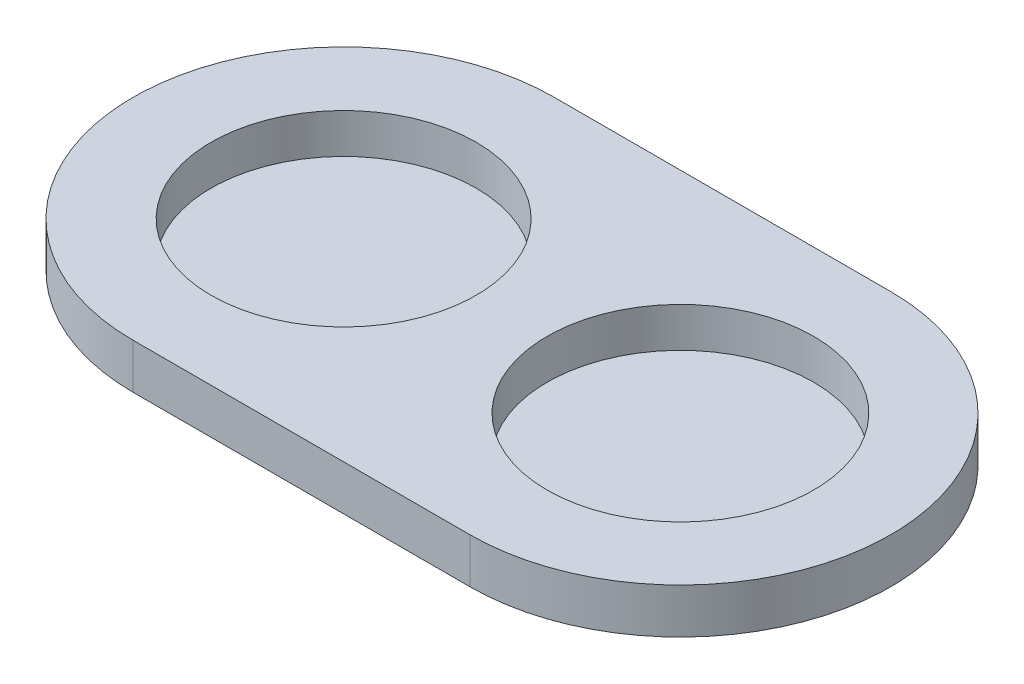
ISO-10303-21;
HEADER;
FILE_DESCRIPTION(('STEP AP214'),'2;1');
FILE_NAME('part.step','',(''),(''),'','','');
FILE_SCHEMA(('AUTOMOTIVE_DESIGN { 1 0 10303 214 1 1 1 1 }'));
ENDSEC;
DATA;
#1=APPLICATION_CONTEXT('core data for automotive mechanical design processes');
#2=APPLICATION_PROTOCOL_DEFINITION('international standard','automotive_design',2000,#1);
#3=PRODUCT_CONTEXT('',#1,'mechanical');
#4=PRODUCT('Part','Part','',(#3));
#5=PRODUCT_RELATED_PRODUCT_CATEGORY('part','',(#4));
#6=PRODUCT_DEFINITION_FORMATION('','',#4);
#7=PRODUCT_DEFINITION_CONTEXT('part definition',#1,'design');
#8=PRODUCT_DEFINITION('design','',#6,#7);
#9=PRODUCT_DEFINITION_SHAPE('','',#8);
#10=(LENGTH_UNIT() NAMED_UNIT(*) SI_UNIT(.MILLI.,.METRE.));
#11=(NAMED_UNIT(*) PLANE_ANGLE_UNIT() SI_UNIT($,.RADIAN.));
#12=(NAMED_UNIT(*) SI_UNIT($,.STERADIAN.) SOLID_ANGLE_UNIT());
#13=UNCERTAINTY_MEASURE_WITH_UNIT(LENGTH_MEASURE(1.E-05),#10,'distance_accuracy_value','');
#14=(GEOMETRIC_REPRESENTATION_CONTEXT(3) GLOBAL_UNCERTAINTY_ASSIGNED_CONTEXT((#13)) GLOBAL_UNIT_ASSIGNED_CONTEXT((#10,
#11,#12)) REPRESENTATION_CONTEXT('',''));
#15=CARTESIAN_POINT('',(0.,0.,0.));
#16=DIRECTION('',(0.,0.,1.));
#17=DIRECTION('',(1.,0.,0.));
#18=AXIS2_PLACEMENT_3D('',#15,#16,#17);
#19=CARTESIAN_POINT('',(0.,3.4,0.));
#20=DIRECTION('',(0.,1.,0.));
#21=DIRECTION('',(0.,0.,1.));
#22=AXIS2_PLACEMENT_3D('',#19,#20,#21);
#23=PLANE('',#22);
#24=CARTESIAN_POINT('',(0.,3.4,0.));
#25=DIRECTION('',(0.,1.,0.));
#26=DIRECTION('',(0.,0.,1.));
#27=AXIS2_PLACEMENT_3D('',#24,#25,#26);
#28=CIRCLE('',#27,10.);
#29=CARTESIAN_POINT('',(0.,3.4,10.));
#30=VERTEX_POINT('',#29);
#31=EDGE_CURVE('E108',#30,#30,#28,.T.);
#32=ORIENTED_EDGE('',*,*,#31,.F.);
#33=EDGE_LOOP('',(#32));
#34=FACE_BOUND('',#33,.T.);
#35=CARTESIAN_POINT('',(0.,3.4,0.));
#36=DIRECTION('',(0.,1.,0.));
#37=DIRECTION('',(0.,0.,1.));
#38=AXIS2_PLACEMENT_3D('',#35,#36,#37);
#39=CIRCLE('',#38,15.875);
#40=CARTESIAN_POINT('',(0.,3.4,-15.875));
#41=VERTEX_POINT('',#40);
#42=CARTESIAN_POINT('',(0.,3.4,15.875));
#43=VERTEX_POINT('',#42);
#44=EDGE_CURVE('E90',#41,#43,#39,.T.);
#45=ORIENTED_EDGE('',*,*,#44,.T.);
#46=DIRECTION('',(1.,0.,0.));
#47=VECTOR('',#46,1.);
#48=CARTESIAN_POINT('',(0.,3.4,15.875));
#49=LINE('',#48,#47);
#50=CARTESIAN_POINT('',(25.4,3.4,15.875));
#51=VERTEX_POINT('',#50);
#52=EDGE_CURVE('E85',#43,#51,#49,.T.);
#53=ORIENTED_EDGE('',*,*,#52,.T.);
#54=CARTESIAN_POINT('',(25.4,3.4,0.));
#55=DIRECTION('',(0.,1.,0.));
#56=DIRECTION('',(0.,0.,1.));
#57=AXIS2_PLACEMENT_3D('',#54,#55,#56);
#58=CIRCLE('',#57,15.875);
#59=CARTESIAN_POINT('',(25.4,3.4,-15.875));
#60=VERTEX_POINT('',#59);
#61=EDGE_CURVE('E88',#51,#60,#58,.T.);
#62=ORIENTED_EDGE('',*,*,#61,.T.);
#63=DIRECTION('',(-1.,0.,0.));
#64=VECTOR('',#63,1.);
#65=CARTESIAN_POINT('',(0.,3.4,-15.875));
#66=LINE('',#65,#64);
#67=EDGE_CURVE('E54',#60,#41,#66,.T.);
#68=ORIENTED_EDGE('',*,*,#67,.T.);
#69=EDGE_LOOP('',(#45,#53,#62,#68));
#70=FACE_BOUND('',#69,.T.);
#71=CARTESIAN_POINT('',(25.4,3.4,0.));
#72=DIRECTION('',(0.,1.,0.));
#73=DIRECTION('',(0.,0.,1.));
#74=AXIS2_PLACEMENT_3D('',#71,#72,#73);
#75=CIRCLE('',#74,10.05);
#76=CARTESIAN_POINT('',(25.4,3.4,10.05));
#77=VERTEX_POINT('',#76);
#78=EDGE_CURVE('E128',#77,#77,#75,.T.);
#79=ORIENTED_EDGE('',*,*,#78,.F.);
#80=EDGE_LOOP('',(#79));
#81=FACE_BOUND('',#80,.T.);
#82=ADVANCED_FACE('F37',(#34,#70,#81),#23,.T.);
#83=CARTESIAN_POINT('',(0.,0.,0.));
#84=DIRECTION('',(0.,1.,0.));
#85=DIRECTION('',(0.,0.,1.));
#86=AXIS2_PLACEMENT_3D('',#83,#84,#85);
#87=PLANE('',#86);
#88=CARTESIAN_POINT('',(0.,0.,0.));
#89=DIRECTION('',(0.,1.,0.));
#90=DIRECTION('',(0.,0.,1.));
#91=AXIS2_PLACEMENT_3D('',#88,#89,#90);
#92=CIRCLE('',#91,15.875);
#93=CARTESIAN_POINT('',(0.,0.,-15.875));
#94=VERTEX_POINT('',#93);
#95=CARTESIAN_POINT('',(0.,0.,15.875));
#96=VERTEX_POINT('',#95);
#97=EDGE_CURVE('E105',#94,#96,#92,.T.);
#98=ORIENTED_EDGE('',*,*,#97,.F.);
#99=DIRECTION('',(-1.,0.,0.));
#100=VECTOR('',#99,1.);
#101=CARTESIAN_POINT('',(0.,0.,-15.875));
#102=LINE('',#101,#100);
#103=CARTESIAN_POINT('',(25.4,0.,-15.875));
#104=VERTEX_POINT('',#103);
#105=EDGE_CURVE('E77',#104,#94,#102,.T.);
#106=ORIENTED_EDGE('',*,*,#105,.F.);
#107=CARTESIAN_POINT('',(25.4,0.,0.));
#108=DIRECTION('',(0.,1.,0.));
#109=DIRECTION('',(0.,0.,1.));
#110=AXIS2_PLACEMENT_3D('',#107,#108,#109);
#111=CIRCLE('',#110,15.875);
#112=CARTESIAN_POINT('',(25.4,0.,15.875));
#113=VERTEX_POINT('',#112);
#114=EDGE_CURVE('E71',#113,#104,#111,.T.);
#115=ORIENTED_EDGE('',*,*,#114,.F.);
#116=DIRECTION('',(1.,0.,0.));
#117=VECTOR('',#116,1.);
#118=CARTESIAN_POINT('',(0.,0.,15.875));
#119=LINE('',#118,#117);
#120=EDGE_CURVE('E95',#96,#113,#119,.T.);
#121=ORIENTED_EDGE('',*,*,#120,.F.);
#122=EDGE_LOOP('',(#98,#106,#115,#121));
#123=FACE_BOUND('',#122,.T.);
#124=ADVANCED_FACE('F135',(#123),#87,.F.);
#125=CARTESIAN_POINT('',(0.,3.4,0.));
#126=DIRECTION('',(0.,-1.,0.));
#127=DIRECTION('',(0.,0.,-1.));
#128=AXIS2_PLACEMENT_3D('',#125,#126,#127);
#129=CYLINDRICAL_SURFACE('',#128,15.875);
#130=ORIENTED_EDGE('',*,*,#97,.T.);
#131=DIRECTION('',(0.,-1.,0.));
#132=VECTOR('',#131,1.);
#133=CARTESIAN_POINT('',(0.,3.4,15.875));
#134=LINE('',#133,#132);
#135=EDGE_CURVE('E96',#43,#96,#134,.T.);
#136=ORIENTED_EDGE('',*,*,#135,.F.);
#137=ORIENTED_EDGE('',*,*,#44,.F.);
#138=DIRECTION('',(0.,-1.,0.));
#139=VECTOR('',#138,1.);
#140=CARTESIAN_POINT('',(0.,3.4,-15.875));
#141=LINE('',#140,#139);
#142=EDGE_CURVE('E101',#41,#94,#141,.T.);
#143=ORIENTED_EDGE('',*,*,#142,.T.);
#144=EDGE_LOOP('',(#130,#136,#137,#143));
#145=FACE_BOUND('',#144,.T.);
#146=ADVANCED_FACE('F39',(#145),#129,.T.);
#147=CARTESIAN_POINT('',(0.,3.4,15.875));
#148=DIRECTION('',(0.,0.,-1.));
#149=DIRECTION('',(-1.,0.,0.));
#150=AXIS2_PLACEMENT_3D('',#147,#148,#149);
#151=PLANE('',#150);
#152=ORIENTED_EDGE('',*,*,#120,.T.);
#153=DIRECTION('',(0.,-1.,0.));
#154=VECTOR('',#153,1.);
#155=CARTESIAN_POINT('',(25.4,3.4,15.875));
#156=LINE('',#155,#154);
#157=EDGE_CURVE('E93',#51,#113,#156,.T.);
#158=ORIENTED_EDGE('',*,*,#157,.F.);
#159=ORIENTED_EDGE('',*,*,#52,.F.);
#160=ORIENTED_EDGE('',*,*,#135,.T.);
#161=EDGE_LOOP('',(#152,#158,#159,#160));
#162=FACE_BOUND('',#161,.T.);
#163=ADVANCED_FACE('F94',(#162),#151,.F.);
#164=CARTESIAN_POINT('',(25.4,3.4,0.));
#165=DIRECTION('',(0.,-1.,0.));
#166=DIRECTION('',(0.,0.,-1.));
#167=AXIS2_PLACEMENT_3D('',#164,#165,#166);
#168=CYLINDRICAL_SURFACE('',#167,15.875);
#169=ORIENTED_EDGE('',*,*,#114,.T.);
#170=DIRECTION('',(0.,-1.,0.));
#171=VECTOR('',#170,1.);
#172=CARTESIAN_POINT('',(25.4,3.4,-15.875));
#173=LINE('',#172,#171);
#174=EDGE_CURVE('E97',#60,#104,#173,.T.);
#175=ORIENTED_EDGE('',*,*,#174,.F.);
#176=ORIENTED_EDGE('',*,*,#61,.F.);
#177=ORIENTED_EDGE('',*,*,#157,.T.);
#178=EDGE_LOOP('',(#169,#175,#176,#177));
#179=FACE_BOUND('',#178,.T.);
#180=ADVANCED_FACE('F99',(#179),#168,.T.);
#181=CARTESIAN_POINT('',(0.,3.4,-15.875));
#182=DIRECTION('',(0.,0.,1.));
#183=DIRECTION('',(1.,0.,0.));
#184=AXIS2_PLACEMENT_3D('',#181,#182,#183);
#185=PLANE('',#184);
#186=ORIENTED_EDGE('',*,*,#105,.T.);
#187=ORIENTED_EDGE('',*,*,#142,.F.);
#188=ORIENTED_EDGE('',*,*,#67,.F.);
#189=ORIENTED_EDGE('',*,*,#174,.T.);
#190=EDGE_LOOP('',(#186,#187,#188,#189));
#191=FACE_BOUND('',#190,.T.);
#192=ADVANCED_FACE('F123',(#191),#185,.F.);
#193=CARTESIAN_POINT('',(0.,3.4,0.));
#194=DIRECTION('',(0.,-1.,0.));
#195=DIRECTION('',(0.,0.,-1.));
#196=AXIS2_PLACEMENT_3D('',#193,#194,#195);
#197=CYLINDRICAL_SURFACE('',#196,10.);
#198=CARTESIAN_POINT('',(0.,0.4,0.));
#199=DIRECTION('',(0.,1.,0.));
#200=DIRECTION('',(0.,0.,1.));
#201=AXIS2_PLACEMENT_3D('',#198,#199,#200);
#202=CIRCLE('',#201,10.);
#203=CARTESIAN_POINT('',(0.,0.4,10.));
#204=VERTEX_POINT('',#203);
#205=EDGE_CURVE('E46',#204,#204,#202,.T.);
#206=ORIENTED_EDGE('',*,*,#205,.F.);
#207=EDGE_LOOP('',(#206));
#208=FACE_BOUND('',#207,.T.);
#209=ORIENTED_EDGE('',*,*,#31,.T.);
#210=EDGE_LOOP('',(#209));
#211=FACE_BOUND('',#210,.T.);
#212=ADVANCED_FACE('F119',(#208,#211),#197,.F.);
#213=CARTESIAN_POINT('',(25.4,3.4,0.));
#214=DIRECTION('',(0.,-1.,0.));
#215=DIRECTION('',(0.,0.,-1.));
#216=AXIS2_PLACEMENT_3D('',#213,#214,#215);
#217=CYLINDRICAL_SURFACE('',#216,10.05);
#218=CARTESIAN_POINT('',(25.4,0.4,0.));
#219=DIRECTION('',(0.,1.,0.));
#220=DIRECTION('',(0.,0.,1.));
#221=AXIS2_PLACEMENT_3D('',#218,#219,#220);
#222=CIRCLE('',#221,10.05);
#223=CARTESIAN_POINT('',(25.4,0.4,10.05));
#224=VERTEX_POINT('',#223);
#225=EDGE_CURVE('E11',#224,#224,#222,.T.);
#226=ORIENTED_EDGE('',*,*,#225,.F.);
#227=EDGE_LOOP('',(#226));
#228=FACE_BOUND('',#227,.T.);
#229=ORIENTED_EDGE('',*,*,#78,.T.);
#230=EDGE_LOOP('',(#229));
#231=FACE_BOUND('',#230,.T.);
#232=ADVANCED_FACE('F122',(#228,#231),#217,.F.);
#233=CARTESIAN_POINT('',(0.,0.4,0.));
#234=DIRECTION('',(0.,1.,0.));
#235=DIRECTION('',(0.,0.,1.));
#236=AXIS2_PLACEMENT_3D('',#233,#234,#235);
#237=PLANE('',#236);
#238=ORIENTED_EDGE('',*,*,#205,.T.);
#239=EDGE_LOOP('',(#238));
#240=FACE_BOUND('',#239,.T.);
#241=ADVANCED_FACE('F117',(#240),#237,.T.);
#242=CARTESIAN_POINT('',(0.,0.4,0.));
#243=DIRECTION('',(0.,1.,0.));
#244=DIRECTION('',(0.,0.,1.));
#245=AXIS2_PLACEMENT_3D('',#242,#243,#244);
#246=PLANE('',#245);
#247=ORIENTED_EDGE('',*,*,#225,.T.);
#248=EDGE_LOOP('',(#247));
#249=FACE_BOUND('',#248,.T.);
#250=ADVANCED_FACE('F189',(#249),#246,.T.);
#251=CLOSED_SHELL('',(#82,#124,#146,#163,#180,#192,#212,#232,#241,#250));
#252=MANIFOLD_SOLID_BREP('B2',#251);
#253=ADVANCED_BREP_SHAPE_REPRESENTATION('',(#18,#252),#14);
#254=SHAPE_DEFINITION_REPRESENTATION(#9,#253);
ENDSEC;
END-ISO-10303-21;
